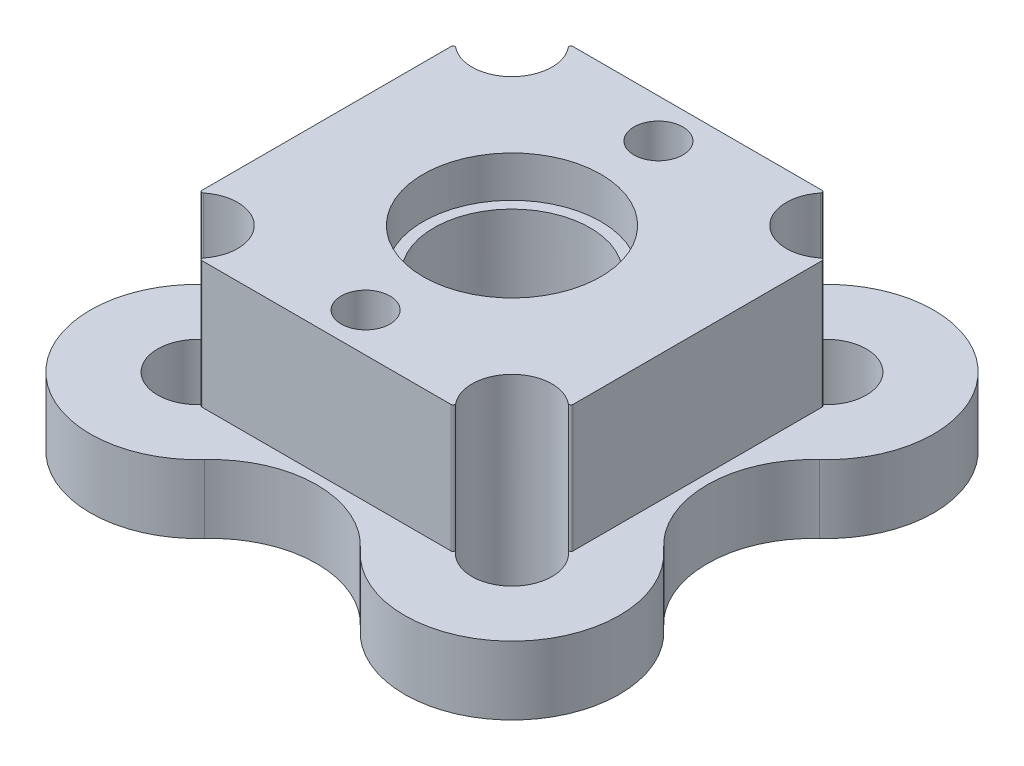
ISO-10303-21;
HEADER;
FILE_DESCRIPTION(('STEP AP214'),'2;1');
FILE_NAME('part.step','',(''),(''),'','','');
FILE_SCHEMA(('AUTOMOTIVE_DESIGN { 1 0 10303 214 1 1 1 1 }'));
ENDSEC;
DATA;
#1=APPLICATION_CONTEXT('core data for automotive mechanical design processes');
#2=APPLICATION_PROTOCOL_DEFINITION('international standard','automotive_design',2000,#1);
#3=PRODUCT_CONTEXT('',#1,'mechanical');
#4=PRODUCT('Part','Part','',(#3));
#5=PRODUCT_RELATED_PRODUCT_CATEGORY('part','',(#4));
#6=PRODUCT_DEFINITION_FORMATION('','',#4);
#7=PRODUCT_DEFINITION_CONTEXT('part definition',#1,'design');
#8=PRODUCT_DEFINITION('design','',#6,#7);
#9=PRODUCT_DEFINITION_SHAPE('','',#8);
#10=(LENGTH_UNIT() NAMED_UNIT(*) SI_UNIT(.MILLI.,.METRE.));
#11=(NAMED_UNIT(*) PLANE_ANGLE_UNIT() SI_UNIT($,.RADIAN.));
#12=(NAMED_UNIT(*) SI_UNIT($,.STERADIAN.) SOLID_ANGLE_UNIT());
#13=UNCERTAINTY_MEASURE_WITH_UNIT(LENGTH_MEASURE(1.E-05),#10,'distance_accuracy_value','');
#14=(GEOMETRIC_REPRESENTATION_CONTEXT(3) GLOBAL_UNCERTAINTY_ASSIGNED_CONTEXT((#13)) GLOBAL_UNIT_ASSIGNED_CONTEXT((#10,
#11,#12)) REPRESENTATION_CONTEXT('',''));
#15=CARTESIAN_POINT('',(0.,0.,0.));
#16=DIRECTION('',(0.,0.,1.));
#17=DIRECTION('',(1.,0.,0.));
#18=AXIS2_PLACEMENT_3D('',#15,#16,#17);
#19=CARTESIAN_POINT('',(0.,0.,0.));
#20=DIRECTION('',(0.,1.,0.));
#21=DIRECTION('',(0.,0.,1.));
#22=AXIS2_PLACEMENT_3D('',#19,#20,#21);
#23=CYLINDRICAL_SURFACE('',#22,4.);
#24=CARTESIAN_POINT('',(0.,0.,0.));
#25=DIRECTION('',(0.,1.,0.));
#26=DIRECTION('',(0.,0.,-1.));
#27=AXIS2_PLACEMENT_3D('',#24,#25,#26);
#28=CIRCLE('',#27,4.);
#29=CARTESIAN_POINT('',(0.,0.,-4.));
#30=VERTEX_POINT('',#29);
#31=EDGE_CURVE('E245',#30,#30,#28,.T.);
#32=ORIENTED_EDGE('',*,*,#31,.F.);
#33=EDGE_LOOP('',(#32));
#34=FACE_BOUND('',#33,.T.);
#35=CARTESIAN_POINT('',(0.,7.9,0.));
#36=DIRECTION('',(0.,1.,0.));
#37=DIRECTION('',(0.,0.,1.));
#38=AXIS2_PLACEMENT_3D('',#35,#36,#37);
#39=CIRCLE('',#38,4.);
#40=CARTESIAN_POINT('',(0.,7.9,4.));
#41=VERTEX_POINT('',#40);
#42=EDGE_CURVE('E243',#41,#41,#39,.F.);
#43=ORIENTED_EDGE('',*,*,#42,.F.);
#44=EDGE_LOOP('',(#43));
#45=FACE_BOUND('',#44,.T.);
#46=ADVANCED_FACE('F32',(#34,#45),#23,.F.);
#47=CARTESIAN_POINT('',(-4.025,3.5,-11.7260563380282));
#48=DIRECTION('',(0.,-1.,0.));
#49=DIRECTION('',(0.,0.,-1.));
#50=AXIS2_PLACEMENT_3D('',#47,#48,#49);
#51=PLANE('',#50);
#52=CARTESIAN_POINT('',(0.,3.5,-15.4021126760563));
#53=DIRECTION('',(0.,-1.,0.));
#54=DIRECTION('',(0.,0.,-1.));
#55=AXIS2_PLACEMENT_3D('',#52,#53,#54);
#56=CIRCLE('',#55,5.40211267605636);
#57=CARTESIAN_POINT('',(3.98886053872489,3.5,-11.7590627220464));
#58=VERTEX_POINT('',#57);
#59=CARTESIAN_POINT('',(-3.98886053872494,3.5,-11.7590627220464));
#60=VERTEX_POINT('',#59);
#61=EDGE_CURVE('E201',#58,#60,#56,.T.);
#62=ORIENTED_EDGE('',*,*,#61,.T.);
#63=CARTESIAN_POINT('',(-8.05,3.5,-8.05));
#64=DIRECTION('',(0.,1.,0.));
#65=DIRECTION('',(0.,0.,-1.));
#66=AXIS2_PLACEMENT_3D('',#63,#64,#65);
#67=CIRCLE('',#66,5.49999999999998);
#68=CARTESIAN_POINT('',(-11.7590627220464,3.5,-3.98886053872491));
#69=VERTEX_POINT('',#68);
#70=EDGE_CURVE('E190',#60,#69,#67,.T.);
#71=ORIENTED_EDGE('',*,*,#70,.T.);
#72=CARTESIAN_POINT('',(-15.4021126760563,3.5,0.));
#73=DIRECTION('',(0.,-1.,0.));
#74=DIRECTION('',(0.,0.,-1.));
#75=AXIS2_PLACEMENT_3D('',#72,#73,#74);
#76=CIRCLE('',#75,5.40211267605634);
#77=CARTESIAN_POINT('',(-11.7590627220464,3.5,3.98886053872486));
#78=VERTEX_POINT('',#77);
#79=EDGE_CURVE('E200',#69,#78,#76,.T.);
#80=ORIENTED_EDGE('',*,*,#79,.T.);
#81=CARTESIAN_POINT('',(-8.05,3.5,8.05));
#82=DIRECTION('',(0.,1.,0.));
#83=DIRECTION('',(0.,0.,-1.));
#84=AXIS2_PLACEMENT_3D('',#81,#82,#83);
#85=CIRCLE('',#84,5.50000000000002);
#86=CARTESIAN_POINT('',(-3.98886053872483,3.5,11.7590627220464));
#87=VERTEX_POINT('',#86);
#88=EDGE_CURVE('E759',#78,#87,#85,.T.);
#89=ORIENTED_EDGE('',*,*,#88,.T.);
#90=CARTESIAN_POINT('',(0.,3.5,15.4021126760564));
#91=DIRECTION('',(0.,-1.,0.));
#92=DIRECTION('',(0.,0.,1.));
#93=AXIS2_PLACEMENT_3D('',#90,#91,#92);
#94=CIRCLE('',#93,5.40211267605632);
#95=CARTESIAN_POINT('',(3.98886053872489,3.5,11.7590627220464));
#96=VERTEX_POINT('',#95);
#97=EDGE_CURVE('E787',#87,#96,#94,.T.);
#98=ORIENTED_EDGE('',*,*,#97,.T.);
#99=CARTESIAN_POINT('',(8.05,3.5,8.05));
#100=DIRECTION('',(0.,1.,0.));
#101=DIRECTION('',(0.,0.,1.));
#102=AXIS2_PLACEMENT_3D('',#99,#100,#101);
#103=CIRCLE('',#102,5.5);
#104=CARTESIAN_POINT('',(11.7590627220464,3.5,3.98886053872488));
#105=VERTEX_POINT('',#104);
#106=EDGE_CURVE('E789',#96,#105,#103,.T.);
#107=ORIENTED_EDGE('',*,*,#106,.T.);
#108=CARTESIAN_POINT('',(15.4021126760563,3.5,0.));
#109=DIRECTION('',(0.,-1.,0.));
#110=DIRECTION('',(0.,0.,1.));
#111=AXIS2_PLACEMENT_3D('',#108,#109,#110);
#112=CIRCLE('',#111,5.40211267605634);
#113=CARTESIAN_POINT('',(11.7590627220464,3.5,-3.98886053872489));
#114=VERTEX_POINT('',#113);
#115=EDGE_CURVE('E791',#105,#114,#112,.T.);
#116=ORIENTED_EDGE('',*,*,#115,.T.);
#117=CARTESIAN_POINT('',(8.05,3.5,-8.05));
#118=DIRECTION('',(0.,1.,0.));
#119=DIRECTION('',(0.,0.,1.));
#120=AXIS2_PLACEMENT_3D('',#117,#118,#119);
#121=CIRCLE('',#120,5.5);
#122=EDGE_CURVE('E206',#114,#58,#121,.T.);
#123=ORIENTED_EDGE('',*,*,#122,.T.);
#124=EDGE_LOOP('',(#62,#71,#80,#89,#98,#107,#116,#123));
#125=FACE_BOUND('',#124,.T.);
#126=DIRECTION('',(-1.,0.,0.));
#127=VECTOR('',#126,1.);
#128=CARTESIAN_POINT('',(6.60086232538105,3.5,-9.5));
#129=LINE('',#128,#127);
#130=CARTESIAN_POINT('',(6.37667994693185,3.5,-9.5));
#131=VERTEX_POINT('',#130);
#132=CARTESIAN_POINT('',(-6.37667994693184,3.5,-9.5));
#133=VERTEX_POINT('',#132);
#134=EDGE_CURVE('E255',#131,#133,#129,.T.);
#135=ORIENTED_EDGE('',*,*,#134,.F.);
#136=CARTESIAN_POINT('',(6.37667994693185,3.5,-9.4));
#137=DIRECTION('',(0.,-1.,0.));
#138=DIRECTION('',(0.,0.,-1.));
#139=AXIS2_PLACEMENT_3D('',#136,#137,#138);
#140=CIRCLE('',#139,0.1);
#141=CARTESIAN_POINT('',(6.45450878660944,3.5,-9.33720930232558));
#142=VERTEX_POINT('',#141);
#143=EDGE_CURVE('E429',#131,#142,#140,.T.);
#144=ORIENTED_EDGE('',*,*,#143,.T.);
#145=CARTESIAN_POINT('',(8.05,3.5,-8.05));
#146=DIRECTION('',(0.,1.,0.));
#147=DIRECTION('',(0.,0.,1.));
#148=AXIS2_PLACEMENT_3D('',#145,#146,#147);
#149=CIRCLE('',#148,2.05);
#150=CARTESIAN_POINT('',(9.33720930232558,3.5,-6.45450878660944));
#151=VERTEX_POINT('',#150);
#152=EDGE_CURVE('E234',#151,#142,#149,.T.);
#153=ORIENTED_EDGE('',*,*,#152,.F.);
#154=CARTESIAN_POINT('',(9.4,3.5,-6.37667994693185));
#155=DIRECTION('',(0.,-1.,0.));
#156=DIRECTION('',(0.,0.,-1.));
#157=AXIS2_PLACEMENT_3D('',#154,#155,#156);
#158=CIRCLE('',#157,0.1);
#159=CARTESIAN_POINT('',(9.5,3.5,-6.37667994693185));
#160=VERTEX_POINT('',#159);
#161=EDGE_CURVE('E426',#151,#160,#158,.T.);
#162=ORIENTED_EDGE('',*,*,#161,.T.);
#163=DIRECTION('',(0.,0.,-1.));
#164=VECTOR('',#163,1.);
#165=CARTESIAN_POINT('',(9.5,3.5,6.60086232538105));
#166=LINE('',#165,#164);
#167=CARTESIAN_POINT('',(9.5,3.5,6.37667994693185));
#168=VERTEX_POINT('',#167);
#169=EDGE_CURVE('E251',#168,#160,#166,.T.);
#170=ORIENTED_EDGE('',*,*,#169,.F.);
#171=CARTESIAN_POINT('',(9.4,3.5,6.37667994693185));
#172=DIRECTION('',(0.,-1.,0.));
#173=DIRECTION('',(0.,0.,-1.));
#174=AXIS2_PLACEMENT_3D('',#171,#172,#173);
#175=CIRCLE('',#174,0.1);
#176=CARTESIAN_POINT('',(9.33720930232558,3.5,6.45450878660944));
#177=VERTEX_POINT('',#176);
#178=EDGE_CURVE('E433',#168,#177,#175,.T.);
#179=ORIENTED_EDGE('',*,*,#178,.T.);
#180=CARTESIAN_POINT('',(8.05,3.5,8.05));
#181=DIRECTION('',(0.,1.,0.));
#182=DIRECTION('',(0.,0.,1.));
#183=AXIS2_PLACEMENT_3D('',#180,#181,#182);
#184=CIRCLE('',#183,2.05);
#185=CARTESIAN_POINT('',(6.45450878660944,3.5,9.33720930232558));
#186=VERTEX_POINT('',#185);
#187=EDGE_CURVE('E231',#186,#177,#184,.T.);
#188=ORIENTED_EDGE('',*,*,#187,.F.);
#189=CARTESIAN_POINT('',(6.37667994693185,3.5,9.4));
#190=DIRECTION('',(0.,-1.,0.));
#191=DIRECTION('',(0.,0.,-1.));
#192=AXIS2_PLACEMENT_3D('',#189,#190,#191);
#193=CIRCLE('',#192,0.1);
#194=CARTESIAN_POINT('',(6.37667994693185,3.5,9.5));
#195=VERTEX_POINT('',#194);
#196=EDGE_CURVE('E441',#186,#195,#193,.T.);
#197=ORIENTED_EDGE('',*,*,#196,.T.);
#198=DIRECTION('',(1.,0.,0.));
#199=VECTOR('',#198,1.);
#200=CARTESIAN_POINT('',(-6.60086232538106,3.5,9.5));
#201=LINE('',#200,#199);
#202=CARTESIAN_POINT('',(-6.37667994693185,3.5,9.5));
#203=VERTEX_POINT('',#202);
#204=EDGE_CURVE('E256',#203,#195,#201,.T.);
#205=ORIENTED_EDGE('',*,*,#204,.F.);
#206=CARTESIAN_POINT('',(-6.37667994693185,3.5,9.4));
#207=DIRECTION('',(0.,-1.,0.));
#208=DIRECTION('',(0.,0.,-1.));
#209=AXIS2_PLACEMENT_3D('',#206,#207,#208);
#210=CIRCLE('',#209,0.1);
#211=CARTESIAN_POINT('',(-6.45450878660944,3.5,9.33720930232558));
#212=VERTEX_POINT('',#211);
#213=EDGE_CURVE('E443',#203,#212,#210,.T.);
#214=ORIENTED_EDGE('',*,*,#213,.T.);
#215=CARTESIAN_POINT('',(-8.05,3.5,8.05));
#216=DIRECTION('',(0.,1.,0.));
#217=DIRECTION('',(0.,0.,1.));
#218=AXIS2_PLACEMENT_3D('',#215,#216,#217);
#219=CIRCLE('',#218,2.05);
#220=CARTESIAN_POINT('',(-9.33720930232558,3.5,6.45450878660943));
#221=VERTEX_POINT('',#220);
#222=EDGE_CURVE('E225',#221,#212,#219,.T.);
#223=ORIENTED_EDGE('',*,*,#222,.F.);
#224=CARTESIAN_POINT('',(-9.4,3.5,6.37667994693184));
#225=DIRECTION('',(0.,-1.,0.));
#226=DIRECTION('',(0.,0.,-1.));
#227=AXIS2_PLACEMENT_3D('',#224,#225,#226);
#228=CIRCLE('',#227,0.1);
#229=CARTESIAN_POINT('',(-9.5,3.5,6.37667994693184));
#230=VERTEX_POINT('',#229);
#231=EDGE_CURVE('E446',#221,#230,#228,.T.);
#232=ORIENTED_EDGE('',*,*,#231,.T.);
#233=DIRECTION('',(0.,0.,1.));
#234=VECTOR('',#233,1.);
#235=CARTESIAN_POINT('',(-9.5,3.5,6.60086232538105));
#236=LINE('',#235,#234);
#237=CARTESIAN_POINT('',(-9.5,3.5,-6.37667994693185));
#238=VERTEX_POINT('',#237);
#239=EDGE_CURVE('E286',#238,#230,#236,.T.);
#240=ORIENTED_EDGE('',*,*,#239,.F.);
#241=CARTESIAN_POINT('',(-9.4,3.5,-6.37667994693185));
#242=DIRECTION('',(0.,-1.,0.));
#243=DIRECTION('',(0.,0.,-1.));
#244=AXIS2_PLACEMENT_3D('',#241,#242,#243);
#245=CIRCLE('',#244,0.1);
#246=CARTESIAN_POINT('',(-9.33720930232558,3.5,-6.45450878660944));
#247=VERTEX_POINT('',#246);
#248=EDGE_CURVE('E40',#238,#247,#245,.T.);
#249=ORIENTED_EDGE('',*,*,#248,.T.);
#250=CARTESIAN_POINT('',(-8.05,3.5,-8.05));
#251=DIRECTION('',(0.,1.,0.));
#252=DIRECTION('',(0.,0.,1.));
#253=AXIS2_PLACEMENT_3D('',#250,#251,#252);
#254=CIRCLE('',#253,2.05);
#255=CARTESIAN_POINT('',(-6.45450878660943,3.5,-9.33720930232558));
#256=VERTEX_POINT('',#255);
#257=EDGE_CURVE('E47',#256,#247,#254,.T.);
#258=ORIENTED_EDGE('',*,*,#257,.F.);
#259=CARTESIAN_POINT('',(-6.37667994693185,3.5,-9.4));
#260=DIRECTION('',(0.,-1.,0.));
#261=DIRECTION('',(0.,0.,-1.));
#262=AXIS2_PLACEMENT_3D('',#259,#260,#261);
#263=CIRCLE('',#262,0.1);
#264=EDGE_CURVE('E11',#256,#133,#263,.T.);
#265=ORIENTED_EDGE('',*,*,#264,.T.);
#266=EDGE_LOOP('',(#135,#144,#153,#162,#170,#179,#188,#197,#205,#214,#223,#232,#240,#249,#258,#265));
#267=FACE_BOUND('',#266,.T.);
#268=ADVANCED_FACE('F204',(#125,#267),#51,.F.);
#269=CARTESIAN_POINT('',(-4.025,0.,-11.7260563380282));
#270=DIRECTION('',(0.,-1.,0.));
#271=DIRECTION('',(0.,0.,-1.));
#272=AXIS2_PLACEMENT_3D('',#269,#270,#271);
#273=PLANE('',#272);
#274=ORIENTED_EDGE('',*,*,#31,.T.);
#275=EDGE_LOOP('',(#274));
#276=FACE_BOUND('',#275,.T.);
#277=CARTESIAN_POINT('',(-8.05,0.,8.05));
#278=DIRECTION('',(0.,1.,0.));
#279=DIRECTION('',(0.,0.,1.));
#280=AXIS2_PLACEMENT_3D('',#277,#278,#279);
#281=CIRCLE('',#280,2.05);
#282=CARTESIAN_POINT('',(-8.05,0.,10.1));
#283=VERTEX_POINT('',#282);
#284=EDGE_CURVE('E227',#283,#283,#281,.T.);
#285=ORIENTED_EDGE('',*,*,#284,.T.);
#286=EDGE_LOOP('',(#285));
#287=FACE_BOUND('',#286,.T.);
#288=CARTESIAN_POINT('',(8.05,0.,8.05));
#289=DIRECTION('',(0.,1.,0.));
#290=DIRECTION('',(0.,0.,1.));
#291=AXIS2_PLACEMENT_3D('',#288,#289,#290);
#292=CIRCLE('',#291,2.05);
#293=CARTESIAN_POINT('',(8.05,0.,10.1));
#294=VERTEX_POINT('',#293);
#295=EDGE_CURVE('E233',#294,#294,#292,.T.);
#296=ORIENTED_EDGE('',*,*,#295,.T.);
#297=EDGE_LOOP('',(#296));
#298=FACE_BOUND('',#297,.T.);
#299=CARTESIAN_POINT('',(8.05,0.,-8.05));
#300=DIRECTION('',(0.,1.,0.));
#301=DIRECTION('',(0.,0.,1.));
#302=AXIS2_PLACEMENT_3D('',#299,#300,#301);
#303=CIRCLE('',#302,2.05);
#304=CARTESIAN_POINT('',(8.05,0.,-6.));
#305=VERTEX_POINT('',#304);
#306=EDGE_CURVE('E236',#305,#305,#303,.T.);
#307=ORIENTED_EDGE('',*,*,#306,.T.);
#308=EDGE_LOOP('',(#307));
#309=FACE_BOUND('',#308,.T.);
#310=CARTESIAN_POINT('',(-8.05,0.,-8.05));
#311=DIRECTION('',(0.,1.,0.));
#312=DIRECTION('',(0.,0.,1.));
#313=AXIS2_PLACEMENT_3D('',#310,#311,#312);
#314=CIRCLE('',#313,2.05);
#315=CARTESIAN_POINT('',(-8.05,0.,-6.));
#316=VERTEX_POINT('',#315);
#317=EDGE_CURVE('E240',#316,#316,#314,.T.);
#318=ORIENTED_EDGE('',*,*,#317,.T.);
#319=EDGE_LOOP('',(#318));
#320=FACE_BOUND('',#319,.T.);
#321=CARTESIAN_POINT('',(0.,0.,7.5));
#322=DIRECTION('',(0.,1.,0.));
#323=DIRECTION('',(0.,0.,1.));
#324=AXIS2_PLACEMENT_3D('',#321,#322,#323);
#325=CIRCLE('',#324,1.25);
#326=CARTESIAN_POINT('',(0.,0.,8.75));
#327=VERTEX_POINT('',#326);
#328=EDGE_CURVE('E798',#327,#327,#325,.T.);
#329=ORIENTED_EDGE('',*,*,#328,.T.);
#330=EDGE_LOOP('',(#329));
#331=FACE_BOUND('',#330,.T.);
#332=CARTESIAN_POINT('',(0.,0.,-15.4021126760563));
#333=DIRECTION('',(0.,-1.,0.));
#334=DIRECTION('',(0.,0.,-1.));
#335=AXIS2_PLACEMENT_3D('',#332,#333,#334);
#336=CIRCLE('',#335,5.40211267605636);
#337=CARTESIAN_POINT('',(3.98886053872489,0.,-11.7590627220464));
#338=VERTEX_POINT('',#337);
#339=CARTESIAN_POINT('',(-3.98886053872494,0.,-11.7590627220464));
#340=VERTEX_POINT('',#339);
#341=EDGE_CURVE('E214',#338,#340,#336,.T.);
#342=ORIENTED_EDGE('',*,*,#341,.F.);
#343=CARTESIAN_POINT('',(8.05,0.,-8.05));
#344=DIRECTION('',(0.,1.,0.));
#345=DIRECTION('',(0.,0.,1.));
#346=AXIS2_PLACEMENT_3D('',#343,#344,#345);
#347=CIRCLE('',#346,5.5);
#348=CARTESIAN_POINT('',(11.7590627220464,0.,-3.98886053872489));
#349=VERTEX_POINT('',#348);
#350=EDGE_CURVE('E210',#349,#338,#347,.T.);
#351=ORIENTED_EDGE('',*,*,#350,.F.);
#352=CARTESIAN_POINT('',(15.4021126760563,0.,0.));
#353=DIRECTION('',(0.,-1.,0.));
#354=DIRECTION('',(0.,0.,1.));
#355=AXIS2_PLACEMENT_3D('',#352,#353,#354);
#356=CIRCLE('',#355,5.40211267605634);
#357=CARTESIAN_POINT('',(11.7590627220464,0.,3.98886053872488));
#358=VERTEX_POINT('',#357);
#359=EDGE_CURVE('E771',#358,#349,#356,.T.);
#360=ORIENTED_EDGE('',*,*,#359,.F.);
#361=CARTESIAN_POINT('',(8.05,0.,8.05));
#362=DIRECTION('',(0.,1.,0.));
#363=DIRECTION('',(0.,0.,1.));
#364=AXIS2_PLACEMENT_3D('',#361,#362,#363);
#365=CIRCLE('',#364,5.5);
#366=CARTESIAN_POINT('',(3.98886053872489,0.,11.7590627220464));
#367=VERTEX_POINT('',#366);
#368=EDGE_CURVE('E766',#367,#358,#365,.T.);
#369=ORIENTED_EDGE('',*,*,#368,.F.);
#370=CARTESIAN_POINT('',(0.,0.,15.4021126760564));
#371=DIRECTION('',(0.,-1.,0.));
#372=DIRECTION('',(0.,0.,1.));
#373=AXIS2_PLACEMENT_3D('',#370,#371,#372);
#374=CIRCLE('',#373,5.40211267605632);
#375=CARTESIAN_POINT('',(-3.98886053872483,0.,11.7590627220464));
#376=VERTEX_POINT('',#375);
#377=EDGE_CURVE('E764',#376,#367,#374,.T.);
#378=ORIENTED_EDGE('',*,*,#377,.F.);
#379=CARTESIAN_POINT('',(-8.05,0.,8.05));
#380=DIRECTION('',(0.,1.,0.));
#381=DIRECTION('',(0.,0.,-1.));
#382=AXIS2_PLACEMENT_3D('',#379,#380,#381);
#383=CIRCLE('',#382,5.50000000000002);
#384=CARTESIAN_POINT('',(-11.7590627220464,0.,3.98886053872486));
#385=VERTEX_POINT('',#384);
#386=EDGE_CURVE('E754',#385,#376,#383,.T.);
#387=ORIENTED_EDGE('',*,*,#386,.F.);
#388=CARTESIAN_POINT('',(-15.4021126760563,0.,0.));
#389=DIRECTION('',(0.,-1.,0.));
#390=DIRECTION('',(0.,0.,-1.));
#391=AXIS2_PLACEMENT_3D('',#388,#389,#390);
#392=CIRCLE('',#391,5.40211267605634);
#393=CARTESIAN_POINT('',(-11.7590627220464,0.,-3.98886053872491));
#394=VERTEX_POINT('',#393);
#395=EDGE_CURVE('E749',#394,#385,#392,.T.);
#396=ORIENTED_EDGE('',*,*,#395,.F.);
#397=CARTESIAN_POINT('',(-8.05,0.,-8.05));
#398=DIRECTION('',(0.,1.,0.));
#399=DIRECTION('',(0.,0.,-1.));
#400=AXIS2_PLACEMENT_3D('',#397,#398,#399);
#401=CIRCLE('',#400,5.49999999999998);
#402=EDGE_CURVE('E755',#340,#394,#401,.T.);
#403=ORIENTED_EDGE('',*,*,#402,.F.);
#404=EDGE_LOOP('',(#342,#351,#360,#369,#378,#387,#396,#403));
#405=FACE_BOUND('',#404,.T.);
#406=CARTESIAN_POINT('',(0.,0.,-7.5));
#407=DIRECTION('',(0.,1.,0.));
#408=DIRECTION('',(0.,0.,-1.));
#409=AXIS2_PLACEMENT_3D('',#406,#407,#408);
#410=CIRCLE('',#409,1.25);
#411=CARTESIAN_POINT('',(0.,0.,-8.75));
#412=VERTEX_POINT('',#411);
#413=EDGE_CURVE('E805',#412,#412,#410,.T.);
#414=ORIENTED_EDGE('',*,*,#413,.T.);
#415=EDGE_LOOP('',(#414));
#416=FACE_BOUND('',#415,.T.);
#417=ADVANCED_FACE('F384',(#276,#287,#298,#309,#320,#331,#405,#416),#273,.T.);
#418=CARTESIAN_POINT('',(0.,3.5,-15.4021126760563));
#419=DIRECTION('',(0.,-1.,0.));
#420=DIRECTION('',(0.,0.,-1.));
#421=AXIS2_PLACEMENT_3D('',#418,#419,#420);
#422=CYLINDRICAL_SURFACE('',#421,5.40211267605636);
#423=ORIENTED_EDGE('',*,*,#341,.T.);
#424=DIRECTION('',(0.,-1.,0.));
#425=VECTOR('',#424,1.);
#426=CARTESIAN_POINT('',(-3.98886053872494,3.5,-11.7590627220464));
#427=LINE('',#426,#425);
#428=EDGE_CURVE('E194',#60,#340,#427,.T.);
#429=ORIENTED_EDGE('',*,*,#428,.F.);
#430=ORIENTED_EDGE('',*,*,#61,.F.);
#431=DIRECTION('',(0.,-1.,0.));
#432=VECTOR('',#431,1.);
#433=CARTESIAN_POINT('',(3.98886053872489,3.5,-11.7590627220464));
#434=LINE('',#433,#432);
#435=EDGE_CURVE('E774',#58,#338,#434,.T.);
#436=ORIENTED_EDGE('',*,*,#435,.T.);
#437=EDGE_LOOP('',(#423,#429,#430,#436));
#438=FACE_BOUND('',#437,.T.);
#439=ADVANCED_FACE('F212',(#438),#422,.F.);
#440=CARTESIAN_POINT('',(-8.05,3.5,-8.05));
#441=DIRECTION('',(0.,-1.,0.));
#442=DIRECTION('',(0.,0.,-1.));
#443=AXIS2_PLACEMENT_3D('',#440,#441,#442);
#444=CYLINDRICAL_SURFACE('',#443,5.49999999999998);
#445=ORIENTED_EDGE('',*,*,#402,.T.);
#446=DIRECTION('',(0.,-1.,0.));
#447=VECTOR('',#446,1.);
#448=CARTESIAN_POINT('',(-11.7590627220464,3.5,-3.98886053872491));
#449=LINE('',#448,#447);
#450=EDGE_CURVE('E197',#69,#394,#449,.T.);
#451=ORIENTED_EDGE('',*,*,#450,.F.);
#452=ORIENTED_EDGE('',*,*,#70,.F.);
#453=ORIENTED_EDGE('',*,*,#428,.T.);
#454=EDGE_LOOP('',(#445,#451,#452,#453));
#455=FACE_BOUND('',#454,.T.);
#456=ADVANCED_FACE('F192',(#455),#444,.T.);
#457=CARTESIAN_POINT('',(-15.4021126760563,3.5,0.));
#458=DIRECTION('',(0.,-1.,0.));
#459=DIRECTION('',(0.,0.,-1.));
#460=AXIS2_PLACEMENT_3D('',#457,#458,#459);
#461=CYLINDRICAL_SURFACE('',#460,5.40211267605634);
#462=ORIENTED_EDGE('',*,*,#395,.T.);
#463=DIRECTION('',(0.,-1.,0.));
#464=VECTOR('',#463,1.);
#465=CARTESIAN_POINT('',(-11.7590627220464,3.5,3.98886053872486));
#466=LINE('',#465,#464);
#467=EDGE_CURVE('E219',#78,#385,#466,.T.);
#468=ORIENTED_EDGE('',*,*,#467,.F.);
#469=ORIENTED_EDGE('',*,*,#79,.F.);
#470=ORIENTED_EDGE('',*,*,#450,.T.);
#471=EDGE_LOOP('',(#462,#468,#469,#470));
#472=FACE_BOUND('',#471,.T.);
#473=ADVANCED_FACE('F719',(#472),#461,.F.);
#474=CARTESIAN_POINT('',(-8.05,3.5,8.05));
#475=DIRECTION('',(0.,-1.,0.));
#476=DIRECTION('',(0.,0.,-1.));
#477=AXIS2_PLACEMENT_3D('',#474,#475,#476);
#478=CYLINDRICAL_SURFACE('',#477,5.50000000000002);
#479=ORIENTED_EDGE('',*,*,#386,.T.);
#480=DIRECTION('',(0.,-1.,0.));
#481=VECTOR('',#480,1.);
#482=CARTESIAN_POINT('',(-3.98886053872483,3.5,11.7590627220464));
#483=LINE('',#482,#481);
#484=EDGE_CURVE('E760',#87,#376,#483,.T.);
#485=ORIENTED_EDGE('',*,*,#484,.F.);
#486=ORIENTED_EDGE('',*,*,#88,.F.);
#487=ORIENTED_EDGE('',*,*,#467,.T.);
#488=EDGE_LOOP('',(#479,#485,#486,#487));
#489=FACE_BOUND('',#488,.T.);
#490=ADVANCED_FACE('F709',(#489),#478,.T.);
#491=CARTESIAN_POINT('',(0.,3.5,15.4021126760564));
#492=DIRECTION('',(0.,-1.,0.));
#493=DIRECTION('',(0.,0.,-1.));
#494=AXIS2_PLACEMENT_3D('',#491,#492,#493);
#495=CYLINDRICAL_SURFACE('',#494,5.40211267605632);
#496=ORIENTED_EDGE('',*,*,#377,.T.);
#497=DIRECTION('',(0.,-1.,0.));
#498=VECTOR('',#497,1.);
#499=CARTESIAN_POINT('',(3.98886053872489,3.5,11.7590627220464));
#500=LINE('',#499,#498);
#501=EDGE_CURVE('E782',#96,#367,#500,.T.);
#502=ORIENTED_EDGE('',*,*,#501,.F.);
#503=ORIENTED_EDGE('',*,*,#97,.F.);
#504=ORIENTED_EDGE('',*,*,#484,.T.);
#505=EDGE_LOOP('',(#496,#502,#503,#504));
#506=FACE_BOUND('',#505,.T.);
#507=ADVANCED_FACE('F699',(#506),#495,.F.);
#508=CARTESIAN_POINT('',(8.05,3.5,8.05));
#509=DIRECTION('',(0.,-1.,0.));
#510=DIRECTION('',(0.,0.,-1.));
#511=AXIS2_PLACEMENT_3D('',#508,#509,#510);
#512=CYLINDRICAL_SURFACE('',#511,5.5);
#513=ORIENTED_EDGE('',*,*,#368,.T.);
#514=DIRECTION('',(0.,-1.,0.));
#515=VECTOR('',#514,1.);
#516=CARTESIAN_POINT('',(11.7590627220464,3.5,3.98886053872488));
#517=LINE('',#516,#515);
#518=EDGE_CURVE('E779',#105,#358,#517,.T.);
#519=ORIENTED_EDGE('',*,*,#518,.F.);
#520=ORIENTED_EDGE('',*,*,#106,.F.);
#521=ORIENTED_EDGE('',*,*,#501,.T.);
#522=EDGE_LOOP('',(#513,#519,#520,#521));
#523=FACE_BOUND('',#522,.T.);
#524=ADVANCED_FACE('F689',(#523),#512,.T.);
#525=CARTESIAN_POINT('',(15.4021126760563,3.5,0.));
#526=DIRECTION('',(0.,-1.,0.));
#527=DIRECTION('',(0.,0.,-1.));
#528=AXIS2_PLACEMENT_3D('',#525,#526,#527);
#529=CYLINDRICAL_SURFACE('',#528,5.40211267605634);
#530=ORIENTED_EDGE('',*,*,#359,.T.);
#531=DIRECTION('',(0.,-1.,0.));
#532=VECTOR('',#531,1.);
#533=CARTESIAN_POINT('',(11.7590627220464,3.5,-3.98886053872489));
#534=LINE('',#533,#532);
#535=EDGE_CURVE('E776',#114,#349,#534,.T.);
#536=ORIENTED_EDGE('',*,*,#535,.F.);
#537=ORIENTED_EDGE('',*,*,#115,.F.);
#538=ORIENTED_EDGE('',*,*,#518,.T.);
#539=EDGE_LOOP('',(#530,#536,#537,#538));
#540=FACE_BOUND('',#539,.T.);
#541=ADVANCED_FACE('F679',(#540),#529,.F.);
#542=CARTESIAN_POINT('',(8.05,3.5,-8.05));
#543=DIRECTION('',(0.,-1.,0.));
#544=DIRECTION('',(0.,0.,-1.));
#545=AXIS2_PLACEMENT_3D('',#542,#543,#544);
#546=CYLINDRICAL_SURFACE('',#545,5.5);
#547=ORIENTED_EDGE('',*,*,#350,.T.);
#548=ORIENTED_EDGE('',*,*,#435,.F.);
#549=ORIENTED_EDGE('',*,*,#122,.F.);
#550=ORIENTED_EDGE('',*,*,#535,.T.);
#551=EDGE_LOOP('',(#547,#548,#549,#550));
#552=FACE_BOUND('',#551,.T.);
#553=ADVANCED_FACE('F374',(#552),#546,.T.);
#554=CARTESIAN_POINT('',(0.,3.5,7.5));
#555=DIRECTION('',(0.,-1.,0.));
#556=DIRECTION('',(0.,0.,-1.));
#557=AXIS2_PLACEMENT_3D('',#554,#555,#556);
#558=CYLINDRICAL_SURFACE('',#557,1.25);
#559=ORIENTED_EDGE('',*,*,#328,.F.);
#560=EDGE_LOOP('',(#559));
#561=FACE_BOUND('',#560,.T.);
#562=CARTESIAN_POINT('',(0.,10.,7.5));
#563=DIRECTION('',(0.,1.,0.));
#564=DIRECTION('',(0.,0.,1.));
#565=AXIS2_PLACEMENT_3D('',#562,#563,#564);
#566=CIRCLE('',#565,1.25);
#567=CARTESIAN_POINT('',(0.,10.,8.75));
#568=VERTEX_POINT('',#567);
#569=EDGE_CURVE('E299',#568,#568,#566,.T.);
#570=ORIENTED_EDGE('',*,*,#569,.T.);
#571=EDGE_LOOP('',(#570));
#572=FACE_BOUND('',#571,.T.);
#573=ADVANCED_FACE('F364',(#561,#572),#558,.F.);
#574=CARTESIAN_POINT('',(0.,3.5,-7.5));
#575=DIRECTION('',(0.,-1.,0.));
#576=DIRECTION('',(0.,0.,-1.));
#577=AXIS2_PLACEMENT_3D('',#574,#575,#576);
#578=CYLINDRICAL_SURFACE('',#577,1.25);
#579=ORIENTED_EDGE('',*,*,#413,.F.);
#580=EDGE_LOOP('',(#579));
#581=FACE_BOUND('',#580,.T.);
#582=CARTESIAN_POINT('',(0.,10.,-7.5));
#583=DIRECTION('',(0.,1.,0.));
#584=DIRECTION('',(0.,0.,1.));
#585=AXIS2_PLACEMENT_3D('',#582,#583,#584);
#586=CIRCLE('',#585,1.25);
#587=CARTESIAN_POINT('',(0.,10.,-6.25));
#588=VERTEX_POINT('',#587);
#589=EDGE_CURVE('E327',#588,#588,#586,.T.);
#590=ORIENTED_EDGE('',*,*,#589,.T.);
#591=EDGE_LOOP('',(#590));
#592=FACE_BOUND('',#591,.T.);
#593=ADVANCED_FACE('F361',(#581,#592),#578,.F.);
#594=CARTESIAN_POINT('',(-8.05,0.,-8.05));
#595=DIRECTION('',(0.,1.,0.));
#596=DIRECTION('',(0.,0.,1.));
#597=AXIS2_PLACEMENT_3D('',#594,#595,#596);
#598=CYLINDRICAL_SURFACE('',#597,2.05);
#599=ORIENTED_EDGE('',*,*,#317,.F.);
#600=EDGE_LOOP('',(#599));
#601=FACE_BOUND('',#600,.T.);
#602=ORIENTED_EDGE('',*,*,#257,.T.);
#603=DIRECTION('',(0.,1.,0.));
#604=VECTOR('',#603,1.);
#605=CARTESIAN_POINT('',(-9.33720930232558,0.,-6.45450878660944));
#606=LINE('',#605,#604);
#607=CARTESIAN_POINT('',(-9.33720930232558,10.,-6.45450878660944));
#608=VERTEX_POINT('',#607);
#609=EDGE_CURVE('E430',#247,#608,#606,.T.);
#610=ORIENTED_EDGE('',*,*,#609,.T.);
#611=CARTESIAN_POINT('',(-8.05,10.,-8.05));
#612=DIRECTION('',(0.,-1.,0.));
#613=DIRECTION('',(0.,0.,1.));
#614=AXIS2_PLACEMENT_3D('',#611,#612,#613);
#615=CIRCLE('',#614,2.05);
#616=CARTESIAN_POINT('',(-6.45450878660943,10.,-9.33720930232558));
#617=VERTEX_POINT('',#616);
#618=EDGE_CURVE('E270',#617,#608,#615,.T.);
#619=ORIENTED_EDGE('',*,*,#618,.F.);
#620=DIRECTION('',(0.,1.,0.));
#621=VECTOR('',#620,1.);
#622=CARTESIAN_POINT('',(-6.45450878660943,0.,-9.33720930232558));
#623=LINE('',#622,#621);
#624=EDGE_CURVE('E435',#617,#256,#623,.F.);
#625=ORIENTED_EDGE('',*,*,#624,.T.);
#626=EDGE_LOOP('',(#602,#610,#619,#625));
#627=FACE_BOUND('',#626,.T.);
#628=ADVANCED_FACE('F363',(#601,#627),#598,.F.);
#629=CARTESIAN_POINT('',(8.05,0.,-8.05));
#630=DIRECTION('',(0.,1.,0.));
#631=DIRECTION('',(0.,0.,1.));
#632=AXIS2_PLACEMENT_3D('',#629,#630,#631);
#633=CYLINDRICAL_SURFACE('',#632,2.05);
#634=ORIENTED_EDGE('',*,*,#306,.F.);
#635=EDGE_LOOP('',(#634));
#636=FACE_BOUND('',#635,.T.);
#637=CARTESIAN_POINT('',(8.05,10.,-8.05));
#638=DIRECTION('',(0.,-1.,0.));
#639=DIRECTION('',(0.,0.,1.));
#640=AXIS2_PLACEMENT_3D('',#637,#638,#639);
#641=CIRCLE('',#640,2.05);
#642=CARTESIAN_POINT('',(9.33720930232558,10.,-6.45450878660944));
#643=VERTEX_POINT('',#642);
#644=CARTESIAN_POINT('',(6.45450878660944,10.,-9.33720930232558));
#645=VERTEX_POINT('',#644);
#646=EDGE_CURVE('E305',#643,#645,#641,.T.);
#647=ORIENTED_EDGE('',*,*,#646,.F.);
#648=DIRECTION('',(0.,1.,0.));
#649=VECTOR('',#648,1.);
#650=CARTESIAN_POINT('',(9.33720930232558,0.,-6.45450878660944));
#651=LINE('',#650,#649);
#652=EDGE_CURVE('E217',#643,#151,#651,.F.);
#653=ORIENTED_EDGE('',*,*,#652,.T.);
#654=ORIENTED_EDGE('',*,*,#152,.T.);
#655=DIRECTION('',(0.,1.,0.));
#656=VECTOR('',#655,1.);
#657=CARTESIAN_POINT('',(6.45450878660944,0.,-9.33720930232558));
#658=LINE('',#657,#656);
#659=EDGE_CURVE('E215',#142,#645,#658,.T.);
#660=ORIENTED_EDGE('',*,*,#659,.T.);
#661=EDGE_LOOP('',(#647,#653,#654,#660));
#662=FACE_BOUND('',#661,.T.);
#663=ADVANCED_FACE('F371',(#636,#662),#633,.F.);
#664=CARTESIAN_POINT('',(8.05,0.,8.05));
#665=DIRECTION('',(0.,1.,0.));
#666=DIRECTION('',(0.,0.,1.));
#667=AXIS2_PLACEMENT_3D('',#664,#665,#666);
#668=CYLINDRICAL_SURFACE('',#667,2.05);
#669=ORIENTED_EDGE('',*,*,#295,.F.);
#670=EDGE_LOOP('',(#669));
#671=FACE_BOUND('',#670,.T.);
#672=ORIENTED_EDGE('',*,*,#187,.T.);
#673=DIRECTION('',(0.,1.,0.));
#674=VECTOR('',#673,1.);
#675=CARTESIAN_POINT('',(9.33720930232558,0.,6.45450878660944));
#676=LINE('',#675,#674);
#677=CARTESIAN_POINT('',(9.33720930232558,10.,6.45450878660944));
#678=VERTEX_POINT('',#677);
#679=EDGE_CURVE('E281',#177,#678,#676,.T.);
#680=ORIENTED_EDGE('',*,*,#679,.T.);
#681=CARTESIAN_POINT('',(8.05,10.,8.05));
#682=DIRECTION('',(0.,-1.,0.));
#683=DIRECTION('',(0.,0.,1.));
#684=AXIS2_PLACEMENT_3D('',#681,#682,#683);
#685=CIRCLE('',#684,2.05);
#686=CARTESIAN_POINT('',(6.45450878660944,10.,9.33720930232558));
#687=VERTEX_POINT('',#686);
#688=EDGE_CURVE('E311',#687,#678,#685,.T.);
#689=ORIENTED_EDGE('',*,*,#688,.F.);
#690=DIRECTION('',(0.,1.,0.));
#691=VECTOR('',#690,1.);
#692=CARTESIAN_POINT('',(6.45450878660944,0.,9.33720930232558));
#693=LINE('',#692,#691);
#694=EDGE_CURVE('E278',#687,#186,#693,.F.);
#695=ORIENTED_EDGE('',*,*,#694,.T.);
#696=EDGE_LOOP('',(#672,#680,#689,#695));
#697=FACE_BOUND('',#696,.T.);
#698=ADVANCED_FACE('F407',(#671,#697),#668,.F.);
#699=CARTESIAN_POINT('',(-8.05,0.,8.05));
#700=DIRECTION('',(0.,1.,0.));
#701=DIRECTION('',(0.,0.,1.));
#702=AXIS2_PLACEMENT_3D('',#699,#700,#701);
#703=CYLINDRICAL_SURFACE('',#702,2.05);
#704=ORIENTED_EDGE('',*,*,#284,.F.);
#705=EDGE_LOOP('',(#704));
#706=FACE_BOUND('',#705,.T.);
#707=ORIENTED_EDGE('',*,*,#222,.T.);
#708=DIRECTION('',(0.,1.,0.));
#709=VECTOR('',#708,1.);
#710=CARTESIAN_POINT('',(-6.45450878660944,0.,9.33720930232558));
#711=LINE('',#710,#709);
#712=CARTESIAN_POINT('',(-6.45450878660944,10.,9.33720930232558));
#713=VERTEX_POINT('',#712);
#714=EDGE_CURVE('E294',#212,#713,#711,.T.);
#715=ORIENTED_EDGE('',*,*,#714,.T.);
#716=CARTESIAN_POINT('',(-8.05,10.,8.05));
#717=DIRECTION('',(0.,-1.,0.));
#718=DIRECTION('',(0.,0.,1.));
#719=AXIS2_PLACEMENT_3D('',#716,#717,#718);
#720=CIRCLE('',#719,2.05);
#721=CARTESIAN_POINT('',(-9.33720930232558,10.,6.45450878660943));
#722=VERTEX_POINT('',#721);
#723=EDGE_CURVE('E317',#722,#713,#720,.T.);
#724=ORIENTED_EDGE('',*,*,#723,.F.);
#725=DIRECTION('',(0.,1.,0.));
#726=VECTOR('',#725,1.);
#727=CARTESIAN_POINT('',(-9.33720930232558,0.,6.45450878660943));
#728=LINE('',#727,#726);
#729=EDGE_CURVE('E291',#722,#221,#728,.F.);
#730=ORIENTED_EDGE('',*,*,#729,.T.);
#731=EDGE_LOOP('',(#707,#715,#724,#730));
#732=FACE_BOUND('',#731,.T.);
#733=ADVANCED_FACE('F352',(#706,#732),#703,.F.);
#734=CARTESIAN_POINT('',(-8.05,10.,-8.05));
#735=DIRECTION('',(0.,1.,0.));
#736=DIRECTION('',(0.,0.,1.));
#737=AXIS2_PLACEMENT_3D('',#734,#735,#736);
#738=PLANE('',#737);
#739=CARTESIAN_POINT('',(0.,10.,0.));
#740=DIRECTION('',(0.,1.,0.));
#741=DIRECTION('',(0.,0.,1.));
#742=AXIS2_PLACEMENT_3D('',#739,#740,#741);
#743=CIRCLE('',#742,4.55);
#744=CARTESIAN_POINT('',(0.,10.,4.55));
#745=VERTEX_POINT('',#744);
#746=EDGE_CURVE('E332',#745,#745,#743,.T.);
#747=ORIENTED_EDGE('',*,*,#746,.F.);
#748=EDGE_LOOP('',(#747));
#749=FACE_BOUND('',#748,.T.);
#750=ORIENTED_EDGE('',*,*,#569,.F.);
#751=EDGE_LOOP('',(#750));
#752=FACE_BOUND('',#751,.T.);
#753=DIRECTION('',(0.,0.,-1.));
#754=VECTOR('',#753,1.);
#755=CARTESIAN_POINT('',(9.5,10.,6.60086232538105));
#756=LINE('',#755,#754);
#757=CARTESIAN_POINT('',(9.5,10.,6.37667994693185));
#758=VERTEX_POINT('',#757);
#759=CARTESIAN_POINT('',(9.5,10.,-6.37667994693185));
#760=VERTEX_POINT('',#759);
#761=EDGE_CURVE('E308',#758,#760,#756,.T.);
#762=ORIENTED_EDGE('',*,*,#761,.T.);
#763=CARTESIAN_POINT('',(9.4,10.,-6.37667994693185));
#764=DIRECTION('',(0.,1.,0.));
#765=DIRECTION('',(0.,0.,1.));
#766=AXIS2_PLACEMENT_3D('',#763,#764,#765);
#767=CIRCLE('',#766,0.1);
#768=EDGE_CURVE('E271',#760,#643,#767,.T.);
#769=ORIENTED_EDGE('',*,*,#768,.T.);
#770=ORIENTED_EDGE('',*,*,#646,.T.);
#771=CARTESIAN_POINT('',(6.37667994693185,10.,-9.4));
#772=DIRECTION('',(0.,1.,0.));
#773=DIRECTION('',(0.,0.,1.));
#774=AXIS2_PLACEMENT_3D('',#771,#772,#773);
#775=CIRCLE('',#774,0.1);
#776=CARTESIAN_POINT('',(6.37667994693185,10.,-9.5));
#777=VERTEX_POINT('',#776);
#778=EDGE_CURVE('E474',#645,#777,#775,.T.);
#779=ORIENTED_EDGE('',*,*,#778,.T.);
#780=DIRECTION('',(-1.,0.,0.));
#781=VECTOR('',#780,1.);
#782=CARTESIAN_POINT('',(6.60086232538105,10.,-9.5));
#783=LINE('',#782,#781);
#784=CARTESIAN_POINT('',(-6.37667994693184,10.,-9.5));
#785=VERTEX_POINT('',#784);
#786=EDGE_CURVE('E228',#777,#785,#783,.T.);
#787=ORIENTED_EDGE('',*,*,#786,.T.);
#788=CARTESIAN_POINT('',(-6.37667994693185,10.,-9.4));
#789=DIRECTION('',(0.,1.,0.));
#790=DIRECTION('',(0.,0.,1.));
#791=AXIS2_PLACEMENT_3D('',#788,#789,#790);
#792=CIRCLE('',#791,0.1);
#793=EDGE_CURVE('E460',#785,#617,#792,.T.);
#794=ORIENTED_EDGE('',*,*,#793,.T.);
#795=ORIENTED_EDGE('',*,*,#618,.T.);
#796=CARTESIAN_POINT('',(-9.4,10.,-6.37667994693185));
#797=DIRECTION('',(0.,1.,0.));
#798=DIRECTION('',(0.,0.,1.));
#799=AXIS2_PLACEMENT_3D('',#796,#797,#798);
#800=CIRCLE('',#799,0.1);
#801=CARTESIAN_POINT('',(-9.5,10.,-6.37667994693185));
#802=VERTEX_POINT('',#801);
#803=EDGE_CURVE('E455',#608,#802,#800,.T.);
#804=ORIENTED_EDGE('',*,*,#803,.T.);
#805=DIRECTION('',(0.,0.,1.));
#806=VECTOR('',#805,1.);
#807=CARTESIAN_POINT('',(-9.5,10.,6.60086232538105));
#808=LINE('',#807,#806);
#809=CARTESIAN_POINT('',(-9.5,10.,6.37667994693184));
#810=VERTEX_POINT('',#809);
#811=EDGE_CURVE('E320',#802,#810,#808,.T.);
#812=ORIENTED_EDGE('',*,*,#811,.T.);
#813=CARTESIAN_POINT('',(-9.4,10.,6.37667994693184));
#814=DIRECTION('',(0.,1.,0.));
#815=DIRECTION('',(0.,0.,1.));
#816=AXIS2_PLACEMENT_3D('',#813,#814,#815);
#817=CIRCLE('',#816,0.1);
#818=EDGE_CURVE('E465',#810,#722,#817,.T.);
#819=ORIENTED_EDGE('',*,*,#818,.T.);
#820=ORIENTED_EDGE('',*,*,#723,.T.);
#821=CARTESIAN_POINT('',(-6.37667994693185,10.,9.4));
#822=DIRECTION('',(0.,1.,0.));
#823=DIRECTION('',(0.,0.,1.));
#824=AXIS2_PLACEMENT_3D('',#821,#822,#823);
#825=CIRCLE('',#824,0.1);
#826=CARTESIAN_POINT('',(-6.37667994693185,10.,9.5));
#827=VERTEX_POINT('',#826);
#828=EDGE_CURVE('E469',#713,#827,#825,.T.);
#829=ORIENTED_EDGE('',*,*,#828,.T.);
#830=DIRECTION('',(1.,0.,0.));
#831=VECTOR('',#830,1.);
#832=CARTESIAN_POINT('',(-6.60086232538106,10.,9.5));
#833=LINE('',#832,#831);
#834=CARTESIAN_POINT('',(6.37667994693185,10.,9.5));
#835=VERTEX_POINT('',#834);
#836=EDGE_CURVE('E314',#827,#835,#833,.T.);
#837=ORIENTED_EDGE('',*,*,#836,.T.);
#838=CARTESIAN_POINT('',(6.37667994693185,10.,9.4));
#839=DIRECTION('',(0.,1.,0.));
#840=DIRECTION('',(0.,0.,1.));
#841=AXIS2_PLACEMENT_3D('',#838,#839,#840);
#842=CIRCLE('',#841,0.1);
#843=EDGE_CURVE('E471',#835,#687,#842,.T.);
#844=ORIENTED_EDGE('',*,*,#843,.T.);
#845=ORIENTED_EDGE('',*,*,#688,.T.);
#846=CARTESIAN_POINT('',(9.4,10.,6.37667994693185));
#847=DIRECTION('',(0.,1.,0.));
#848=DIRECTION('',(0.,0.,1.));
#849=AXIS2_PLACEMENT_3D('',#846,#847,#848);
#850=CIRCLE('',#849,0.1);
#851=EDGE_CURVE('E473',#678,#758,#850,.T.);
#852=ORIENTED_EDGE('',*,*,#851,.T.);
#853=EDGE_LOOP('',(#762,#769,#770,#779,#787,#794,#795,#804,#812,#819,#820,#829,#837,#844,#845,#852));
#854=FACE_BOUND('',#853,.T.);
#855=ORIENTED_EDGE('',*,*,#589,.F.);
#856=EDGE_LOOP('',(#855));
#857=FACE_BOUND('',#856,.T.);
#858=ADVANCED_FACE('F348',(#749,#752,#854,#857),#738,.T.);
#859=CARTESIAN_POINT('',(-9.5,10.,6.60086232538105));
#860=DIRECTION('',(1.,0.,0.));
#861=DIRECTION('',(0.,0.,-1.));
#862=AXIS2_PLACEMENT_3D('',#859,#860,#861);
#863=PLANE('',#862);
#864=ORIENTED_EDGE('',*,*,#239,.T.);
#865=DIRECTION('',(0.,1.,0.));
#866=VECTOR('',#865,1.);
#867=CARTESIAN_POINT('',(-9.5,10.,6.37667994693184));
#868=LINE('',#867,#866);
#869=EDGE_CURVE('E478',#230,#810,#868,.T.);
#870=ORIENTED_EDGE('',*,*,#869,.T.);
#871=ORIENTED_EDGE('',*,*,#811,.F.);
#872=DIRECTION('',(0.,1.,0.));
#873=VECTOR('',#872,1.);
#874=CARTESIAN_POINT('',(-9.5,10.,-6.37667994693185));
#875=LINE('',#874,#873);
#876=EDGE_CURVE('E296',#802,#238,#875,.F.);
#877=ORIENTED_EDGE('',*,*,#876,.T.);
#878=EDGE_LOOP('',(#864,#870,#871,#877));
#879=FACE_BOUND('',#878,.T.);
#880=ADVANCED_FACE('F351',(#879),#863,.F.);
#881=CARTESIAN_POINT('',(-6.60086232538106,10.,9.5));
#882=DIRECTION('',(0.,0.,-1.));
#883=DIRECTION('',(-1.,0.,0.));
#884=AXIS2_PLACEMENT_3D('',#881,#882,#883);
#885=PLANE('',#884);
#886=ORIENTED_EDGE('',*,*,#204,.T.);
#887=DIRECTION('',(0.,1.,0.));
#888=VECTOR('',#887,1.);
#889=CARTESIAN_POINT('',(6.37667994693185,10.,9.5));
#890=LINE('',#889,#888);
#891=EDGE_CURVE('E289',#195,#835,#890,.T.);
#892=ORIENTED_EDGE('',*,*,#891,.T.);
#893=ORIENTED_EDGE('',*,*,#836,.F.);
#894=DIRECTION('',(0.,1.,0.));
#895=VECTOR('',#894,1.);
#896=CARTESIAN_POINT('',(-6.37667994693185,10.,9.5));
#897=LINE('',#896,#895);
#898=EDGE_CURVE('E283',#827,#203,#897,.F.);
#899=ORIENTED_EDGE('',*,*,#898,.T.);
#900=EDGE_LOOP('',(#886,#892,#893,#899));
#901=FACE_BOUND('',#900,.T.);
#902=ADVANCED_FACE('F397',(#901),#885,.F.);
#903=CARTESIAN_POINT('',(9.5,10.,6.60086232538105));
#904=DIRECTION('',(-1.,0.,0.));
#905=DIRECTION('',(0.,0.,1.));
#906=AXIS2_PLACEMENT_3D('',#903,#904,#905);
#907=PLANE('',#906);
#908=ORIENTED_EDGE('',*,*,#169,.T.);
#909=DIRECTION('',(0.,1.,0.));
#910=VECTOR('',#909,1.);
#911=CARTESIAN_POINT('',(9.5,10.,-6.37667994693185));
#912=LINE('',#911,#910);
#913=EDGE_CURVE('E427',#160,#760,#912,.T.);
#914=ORIENTED_EDGE('',*,*,#913,.T.);
#915=ORIENTED_EDGE('',*,*,#761,.F.);
#916=DIRECTION('',(0.,1.,0.));
#917=VECTOR('',#916,1.);
#918=CARTESIAN_POINT('',(9.5,10.,6.37667994693185));
#919=LINE('',#918,#917);
#920=EDGE_CURVE('E250',#758,#168,#919,.F.);
#921=ORIENTED_EDGE('',*,*,#920,.T.);
#922=EDGE_LOOP('',(#908,#914,#915,#921));
#923=FACE_BOUND('',#922,.T.);
#924=ADVANCED_FACE('F393',(#923),#907,.F.);
#925=CARTESIAN_POINT('',(6.60086232538105,10.,-9.5));
#926=DIRECTION('',(0.,0.,1.));
#927=DIRECTION('',(1.,0.,0.));
#928=AXIS2_PLACEMENT_3D('',#925,#926,#927);
#929=PLANE('',#928);
#930=ORIENTED_EDGE('',*,*,#786,.F.);
#931=DIRECTION('',(0.,1.,0.));
#932=VECTOR('',#931,1.);
#933=CARTESIAN_POINT('',(6.37667994693185,10.,-9.5));
#934=LINE('',#933,#932);
#935=EDGE_CURVE('E275',#777,#131,#934,.F.);
#936=ORIENTED_EDGE('',*,*,#935,.T.);
#937=ORIENTED_EDGE('',*,*,#134,.T.);
#938=DIRECTION('',(0.,1.,0.));
#939=VECTOR('',#938,1.);
#940=CARTESIAN_POINT('',(-6.37667994693185,10.,-9.5));
#941=LINE('',#940,#939);
#942=EDGE_CURVE('E273',#133,#785,#941,.T.);
#943=ORIENTED_EDGE('',*,*,#942,.T.);
#944=EDGE_LOOP('',(#930,#936,#937,#943));
#945=FACE_BOUND('',#944,.T.);
#946=ADVANCED_FACE('F390',(#945),#929,.F.);
#947=CARTESIAN_POINT('',(0.,7.9,0.));
#948=DIRECTION('',(0.,1.,0.));
#949=DIRECTION('',(0.,0.,1.));
#950=AXIS2_PLACEMENT_3D('',#947,#948,#949);
#951=PLANE('',#950);
#952=CARTESIAN_POINT('',(0.,7.9,0.));
#953=DIRECTION('',(0.,1.,0.));
#954=DIRECTION('',(0.,0.,1.));
#955=AXIS2_PLACEMENT_3D('',#952,#953,#954);
#956=CIRCLE('',#955,4.55);
#957=CARTESIAN_POINT('',(0.,7.9,4.55));
#958=VERTEX_POINT('',#957);
#959=EDGE_CURVE('E246',#958,#958,#956,.T.);
#960=ORIENTED_EDGE('',*,*,#959,.T.);
#961=EDGE_LOOP('',(#960));
#962=FACE_BOUND('',#961,.T.);
#963=ORIENTED_EDGE('',*,*,#42,.T.);
#964=EDGE_LOOP('',(#963));
#965=FACE_BOUND('',#964,.T.);
#966=ADVANCED_FACE('F338',(#962,#965),#951,.T.);
#967=CARTESIAN_POINT('',(0.,7.9,0.));
#968=DIRECTION('',(0.,1.,0.));
#969=DIRECTION('',(0.,0.,1.));
#970=AXIS2_PLACEMENT_3D('',#967,#968,#969);
#971=CYLINDRICAL_SURFACE('',#970,4.55);
#972=ORIENTED_EDGE('',*,*,#959,.F.);
#973=EDGE_LOOP('',(#972));
#974=FACE_BOUND('',#973,.T.);
#975=ORIENTED_EDGE('',*,*,#746,.T.);
#976=EDGE_LOOP('',(#975));
#977=FACE_BOUND('',#976,.T.);
#978=ADVANCED_FACE('F341',(#974,#977),#971,.F.);
#979=CARTESIAN_POINT('',(9.4,0.,-6.37667994693185));
#980=DIRECTION('',(0.,1.,0.));
#981=DIRECTION('',(0.,0.,1.));
#982=AXIS2_PLACEMENT_3D('',#979,#980,#981);
#983=CYLINDRICAL_SURFACE('',#982,0.1);
#984=ORIENTED_EDGE('',*,*,#768,.F.);
#985=ORIENTED_EDGE('',*,*,#913,.F.);
#986=ORIENTED_EDGE('',*,*,#161,.F.);
#987=ORIENTED_EDGE('',*,*,#652,.F.);
#988=EDGE_LOOP('',(#984,#985,#986,#987));
#989=FACE_BOUND('',#988,.T.);
#990=ADVANCED_FACE('F344',(#989),#983,.T.);
#991=CARTESIAN_POINT('',(6.37667994693185,0.,-9.4));
#992=DIRECTION('',(0.,1.,0.));
#993=DIRECTION('',(0.,0.,1.));
#994=AXIS2_PLACEMENT_3D('',#991,#992,#993);
#995=CYLINDRICAL_SURFACE('',#994,0.1);
#996=ORIENTED_EDGE('',*,*,#778,.F.);
#997=ORIENTED_EDGE('',*,*,#659,.F.);
#998=ORIENTED_EDGE('',*,*,#143,.F.);
#999=ORIENTED_EDGE('',*,*,#935,.F.);
#1000=EDGE_LOOP('',(#996,#997,#998,#999));
#1001=FACE_BOUND('',#1000,.T.);
#1002=ADVANCED_FACE('F477',(#1001),#995,.T.);
#1003=CARTESIAN_POINT('',(9.4,0.,6.37667994693185));
#1004=DIRECTION('',(0.,1.,0.));
#1005=DIRECTION('',(0.,0.,1.));
#1006=AXIS2_PLACEMENT_3D('',#1003,#1004,#1005);
#1007=CYLINDRICAL_SURFACE('',#1006,0.1);
#1008=ORIENTED_EDGE('',*,*,#851,.F.);
#1009=ORIENTED_EDGE('',*,*,#679,.F.);
#1010=ORIENTED_EDGE('',*,*,#178,.F.);
#1011=ORIENTED_EDGE('',*,*,#920,.F.);
#1012=EDGE_LOOP('',(#1008,#1009,#1010,#1011));
#1013=FACE_BOUND('',#1012,.T.);
#1014=ADVANCED_FACE('F506',(#1013),#1007,.T.);
#1015=CARTESIAN_POINT('',(6.37667994693185,0.,9.4));
#1016=DIRECTION('',(0.,1.,0.));
#1017=DIRECTION('',(0.,0.,1.));
#1018=AXIS2_PLACEMENT_3D('',#1015,#1016,#1017);
#1019=CYLINDRICAL_SURFACE('',#1018,0.1);
#1020=ORIENTED_EDGE('',*,*,#843,.F.);
#1021=ORIENTED_EDGE('',*,*,#891,.F.);
#1022=ORIENTED_EDGE('',*,*,#196,.F.);
#1023=ORIENTED_EDGE('',*,*,#694,.F.);
#1024=EDGE_LOOP('',(#1020,#1021,#1022,#1023));
#1025=FACE_BOUND('',#1024,.T.);
#1026=ADVANCED_FACE('F499',(#1025),#1019,.T.);
#1027=CARTESIAN_POINT('',(-6.37667994693185,0.,9.4));
#1028=DIRECTION('',(0.,1.,0.));
#1029=DIRECTION('',(0.,0.,1.));
#1030=AXIS2_PLACEMENT_3D('',#1027,#1028,#1029);
#1031=CYLINDRICAL_SURFACE('',#1030,0.1);
#1032=ORIENTED_EDGE('',*,*,#828,.F.);
#1033=ORIENTED_EDGE('',*,*,#714,.F.);
#1034=ORIENTED_EDGE('',*,*,#213,.F.);
#1035=ORIENTED_EDGE('',*,*,#898,.F.);
#1036=EDGE_LOOP('',(#1032,#1033,#1034,#1035));
#1037=FACE_BOUND('',#1036,.T.);
#1038=ADVANCED_FACE('F492',(#1037),#1031,.T.);
#1039=CARTESIAN_POINT('',(-9.4,0.,6.37667994693184));
#1040=DIRECTION('',(0.,1.,0.));
#1041=DIRECTION('',(0.,0.,1.));
#1042=AXIS2_PLACEMENT_3D('',#1039,#1040,#1041);
#1043=CYLINDRICAL_SURFACE('',#1042,0.1);
#1044=ORIENTED_EDGE('',*,*,#818,.F.);
#1045=ORIENTED_EDGE('',*,*,#869,.F.);
#1046=ORIENTED_EDGE('',*,*,#231,.F.);
#1047=ORIENTED_EDGE('',*,*,#729,.F.);
#1048=EDGE_LOOP('',(#1044,#1045,#1046,#1047));
#1049=FACE_BOUND('',#1048,.T.);
#1050=ADVANCED_FACE('F484',(#1049),#1043,.T.);
#1051=CARTESIAN_POINT('',(-9.4,0.,-6.37667994693185));
#1052=DIRECTION('',(0.,1.,0.));
#1053=DIRECTION('',(0.,0.,1.));
#1054=AXIS2_PLACEMENT_3D('',#1051,#1052,#1053);
#1055=CYLINDRICAL_SURFACE('',#1054,0.1);
#1056=ORIENTED_EDGE('',*,*,#803,.F.);
#1057=ORIENTED_EDGE('',*,*,#609,.F.);
#1058=ORIENTED_EDGE('',*,*,#248,.F.);
#1059=ORIENTED_EDGE('',*,*,#876,.F.);
#1060=EDGE_LOOP('',(#1056,#1057,#1058,#1059));
#1061=FACE_BOUND('',#1060,.T.);
#1062=ADVANCED_FACE('F454',(#1061),#1055,.T.);
#1063=CARTESIAN_POINT('',(-6.37667994693185,0.,-9.4));
#1064=DIRECTION('',(0.,1.,0.));
#1065=DIRECTION('',(0.,0.,1.));
#1066=AXIS2_PLACEMENT_3D('',#1063,#1064,#1065);
#1067=CYLINDRICAL_SURFACE('',#1066,0.1);
#1068=ORIENTED_EDGE('',*,*,#793,.F.);
#1069=ORIENTED_EDGE('',*,*,#942,.F.);
#1070=ORIENTED_EDGE('',*,*,#264,.F.);
#1071=ORIENTED_EDGE('',*,*,#624,.F.);
#1072=EDGE_LOOP('',(#1068,#1069,#1070,#1071));
#1073=FACE_BOUND('',#1072,.T.);
#1074=ADVANCED_FACE('F34',(#1073),#1067,.T.);
#1075=CLOSED_SHELL('',(#46,#268,#417,#439,#456,#473,#490,#507,#524,#541,#553,#573,#593,#628,
#663,#698,#733,#858,#880,#902,#924,#946,#966,#978,#990,#1002,#1014,#1026,#1038,#1050,#1062,#1074));
#1076=MANIFOLD_SOLID_BREP('B2',#1075);
#1077=ADVANCED_BREP_SHAPE_REPRESENTATION('',(#18,#1076),#14);
#1078=SHAPE_DEFINITION_REPRESENTATION(#9,#1077);
ENDSEC;
END-ISO-10303-21;
